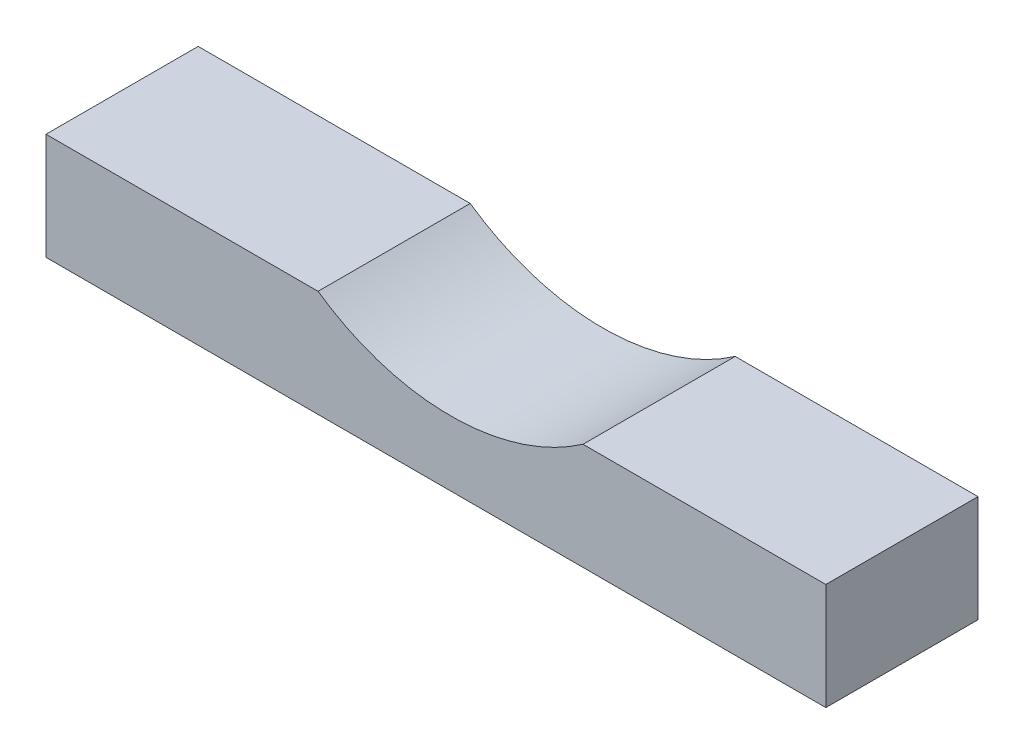
ISO-10303-21;
HEADER;
FILE_DESCRIPTION(('STEP AP214'),'2;1');
FILE_NAME('part.step','',(''),(''),'','','');
FILE_SCHEMA(('AUTOMOTIVE_DESIGN { 1 0 10303 214 1 1 1 1 }'));
ENDSEC;
DATA;
#1=APPLICATION_CONTEXT('core data for automotive mechanical design processes');
#2=APPLICATION_PROTOCOL_DEFINITION('international standard','automotive_design',2000,#1);
#3=PRODUCT_CONTEXT('',#1,'mechanical');
#4=PRODUCT('Part','Part','',(#3));
#5=PRODUCT_RELATED_PRODUCT_CATEGORY('part','',(#4));
#6=PRODUCT_DEFINITION_FORMATION('','',#4);
#7=PRODUCT_DEFINITION_CONTEXT('part definition',#1,'design');
#8=PRODUCT_DEFINITION('design','',#6,#7);
#9=PRODUCT_DEFINITION_SHAPE('','',#8);
#10=(LENGTH_UNIT() NAMED_UNIT(*) SI_UNIT(.MILLI.,.METRE.));
#11=(NAMED_UNIT(*) PLANE_ANGLE_UNIT() SI_UNIT($,.RADIAN.));
#12=(NAMED_UNIT(*) SI_UNIT($,.STERADIAN.) SOLID_ANGLE_UNIT());
#13=UNCERTAINTY_MEASURE_WITH_UNIT(LENGTH_MEASURE(1.E-05),#10,'distance_accuracy_value','');
#14=(GEOMETRIC_REPRESENTATION_CONTEXT(3) GLOBAL_UNCERTAINTY_ASSIGNED_CONTEXT((#13)) GLOBAL_UNIT_ASSIGNED_CONTEXT((#10,
#11,#12)) REPRESENTATION_CONTEXT('',''));
#15=CARTESIAN_POINT('',(0.,0.,0.));
#16=DIRECTION('',(0.,0.,1.));
#17=DIRECTION('',(1.,0.,0.));
#18=AXIS2_PLACEMENT_3D('',#15,#16,#17);
#19=CARTESIAN_POINT('',(0.,0.,0.));
#20=DIRECTION('',(0.,0.,1.));
#21=DIRECTION('',(1.,0.,0.));
#22=AXIS2_PLACEMENT_3D('',#19,#20,#21);
#23=PLANE('',#22);
#24=DIRECTION('',(0.,1.,0.));
#25=VECTOR('',#24,1.);
#26=CARTESIAN_POINT('',(-101.288011779111,-74.3328180867016,0.));
#27=LINE('',#26,#25);
#28=CARTESIAN_POINT('',(-101.288011779111,-74.3328180867016,0.));
#29=VERTEX_POINT('',#28);
#30=CARTESIAN_POINT('',(-101.288011779111,-47.6274288724276,0.));
#31=VERTEX_POINT('',#30);
#32=EDGE_CURVE('E98',#29,#31,#27,.T.);
#33=ORIENTED_EDGE('',*,*,#32,.F.);
#34=DIRECTION('',(-1.,0.,0.));
#35=VECTOR('',#34,1.);
#36=CARTESIAN_POINT('',(93.967860132655,-74.3328180867016,0.));
#37=LINE('',#36,#35);
#38=CARTESIAN_POINT('',(93.967860132655,-74.3328180867016,0.));
#39=VERTEX_POINT('',#38);
#40=EDGE_CURVE('E116',#39,#29,#37,.T.);
#41=ORIENTED_EDGE('',*,*,#40,.F.);
#42=DIRECTION('',(0.,1.,0.));
#43=VECTOR('',#42,1.);
#44=CARTESIAN_POINT('',(93.967860132655,-74.3328180867016,0.));
#45=LINE('',#44,#43);
#46=CARTESIAN_POINT('',(93.967860132655,-47.6274288724276,0.));
#47=VERTEX_POINT('',#46);
#48=EDGE_CURVE('E113',#39,#47,#45,.T.);
#49=ORIENTED_EDGE('',*,*,#48,.T.);
#50=DIRECTION('',(1.,0.,0.));
#51=VECTOR('',#50,1.);
#52=CARTESIAN_POINT('',(33.1703123139027,-47.6274288724276,0.));
#53=LINE('',#52,#51);
#54=CARTESIAN_POINT('',(33.1703123139027,-47.6274288724277,0.));
#55=VERTEX_POINT('',#54);
#56=EDGE_CURVE('E110',#55,#47,#53,.T.);
#57=ORIENTED_EDGE('',*,*,#56,.F.);
#58=CARTESIAN_POINT('',(0.,0.,0.));
#59=DIRECTION('',(0.,0.,1.));
#60=DIRECTION('',(1.,0.,0.));
#61=AXIS2_PLACEMENT_3D('',#58,#59,#60);
#62=CIRCLE('',#61,58.04);
#63=CARTESIAN_POINT('',(-33.1703123139027,-47.6274288724276,0.));
#64=VERTEX_POINT('',#63);
#65=EDGE_CURVE('E101',#64,#55,#62,.T.);
#66=ORIENTED_EDGE('',*,*,#65,.F.);
#67=DIRECTION('',(1.,0.,0.));
#68=VECTOR('',#67,1.);
#69=CARTESIAN_POINT('',(-101.288011779111,-47.6274288724276,0.));
#70=LINE('',#69,#68);
#71=EDGE_CURVE('E90',#31,#64,#70,.T.);
#72=ORIENTED_EDGE('',*,*,#71,.F.);
#73=EDGE_LOOP('',(#33,#41,#49,#57,#66,#72));
#74=FACE_BOUND('',#73,.T.);
#75=ADVANCED_FACE('F34',(#74),#23,.T.);
#76=CARTESIAN_POINT('',(93.967860132655,-74.3328180867016,-235.173674875945));
#77=DIRECTION('',(0.,1.,0.));
#78=DIRECTION('',(-1.,0.,0.));
#79=AXIS2_PLACEMENT_3D('',#76,#77,#78);
#80=PLANE('',#79);
#81=DIRECTION('',(0.,0.,1.));
#82=VECTOR('',#81,1.);
#83=CARTESIAN_POINT('',(-101.288011779111,-74.3328180867016,-235.173674875945));
#84=LINE('',#83,#82);
#85=CARTESIAN_POINT('',(-101.288011779111,-74.3328180867016,-38.1));
#86=VERTEX_POINT('',#85);
#87=EDGE_CURVE('E104',#86,#29,#84,.T.);
#88=ORIENTED_EDGE('',*,*,#87,.F.);
#89=DIRECTION('',(1.,0.,0.));
#90=VECTOR('',#89,1.);
#91=CARTESIAN_POINT('',(93.967860132655,-74.3328180867016,-38.1));
#92=LINE('',#91,#90);
#93=CARTESIAN_POINT('',(93.967860132655,-74.3328180867016,-38.1));
#94=VERTEX_POINT('',#93);
#95=EDGE_CURVE('E38',#86,#94,#92,.T.);
#96=ORIENTED_EDGE('',*,*,#95,.T.);
#97=DIRECTION('',(0.,0.,1.));
#98=VECTOR('',#97,1.);
#99=CARTESIAN_POINT('',(93.967860132655,-74.3328180867016,-235.173674875945));
#100=LINE('',#99,#98);
#101=EDGE_CURVE('E119',#94,#39,#100,.T.);
#102=ORIENTED_EDGE('',*,*,#101,.T.);
#103=ORIENTED_EDGE('',*,*,#40,.T.);
#104=EDGE_LOOP('',(#88,#96,#102,#103));
#105=FACE_BOUND('',#104,.T.);
#106=ADVANCED_FACE('F137',(#105),#80,.F.);
#107=CARTESIAN_POINT('',(93.967860132655,-74.3328180867016,-235.173674875945));
#108=DIRECTION('',(1.,0.,0.));
#109=DIRECTION('',(0.,0.,-1.));
#110=AXIS2_PLACEMENT_3D('',#107,#108,#109);
#111=PLANE('',#110);
#112=DIRECTION('',(0.,-1.,0.));
#113=VECTOR('',#112,1.);
#114=CARTESIAN_POINT('',(93.967860132655,-74.3328180867016,-38.1));
#115=LINE('',#114,#113);
#116=CARTESIAN_POINT('',(93.967860132655,-47.6274288724276,-38.1));
#117=VERTEX_POINT('',#116);
#118=EDGE_CURVE('E130',#117,#94,#115,.T.);
#119=ORIENTED_EDGE('',*,*,#118,.F.);
#120=DIRECTION('',(0.,0.,1.));
#121=VECTOR('',#120,1.);
#122=CARTESIAN_POINT('',(93.967860132655,-47.6274288724276,-235.173674875945));
#123=LINE('',#122,#121);
#124=EDGE_CURVE('E121',#117,#47,#123,.T.);
#125=ORIENTED_EDGE('',*,*,#124,.T.);
#126=ORIENTED_EDGE('',*,*,#48,.F.);
#127=ORIENTED_EDGE('',*,*,#101,.F.);
#128=EDGE_LOOP('',(#119,#125,#126,#127));
#129=FACE_BOUND('',#128,.T.);
#130=ADVANCED_FACE('F149',(#129),#111,.T.);
#131=CARTESIAN_POINT('',(33.1703123139027,-47.6274288724276,-235.173674875945));
#132=DIRECTION('',(0.,-1.,0.));
#133=DIRECTION('',(0.,0.,-1.));
#134=AXIS2_PLACEMENT_3D('',#131,#132,#133);
#135=PLANE('',#134);
#136=ORIENTED_EDGE('',*,*,#124,.F.);
#137=DIRECTION('',(-1.,0.,0.));
#138=VECTOR('',#137,1.);
#139=CARTESIAN_POINT('',(33.1703123139027,-47.6274288724276,-38.1));
#140=LINE('',#139,#138);
#141=CARTESIAN_POINT('',(33.1703123139027,-47.6274288724276,-38.1));
#142=VERTEX_POINT('',#141);
#143=EDGE_CURVE('E128',#117,#142,#140,.T.);
#144=ORIENTED_EDGE('',*,*,#143,.T.);
#145=DIRECTION('',(0.,0.,1.));
#146=VECTOR('',#145,1.);
#147=CARTESIAN_POINT('',(33.1703123139027,-47.6274288724277,-235.173674875945));
#148=LINE('',#147,#146);
#149=EDGE_CURVE('E123',#142,#55,#148,.T.);
#150=ORIENTED_EDGE('',*,*,#149,.T.);
#151=ORIENTED_EDGE('',*,*,#56,.T.);
#152=EDGE_LOOP('',(#136,#144,#150,#151));
#153=FACE_BOUND('',#152,.T.);
#154=ADVANCED_FACE('F154',(#153),#135,.F.);
#155=CARTESIAN_POINT('',(0.,0.,-235.173674875945));
#156=DIRECTION('',(0.,0.,1.));
#157=DIRECTION('',(1.,0.,0.));
#158=AXIS2_PLACEMENT_3D('',#155,#156,#157);
#159=CYLINDRICAL_SURFACE('',#158,58.04);
#160=ORIENTED_EDGE('',*,*,#149,.F.);
#161=CARTESIAN_POINT('',(0.,0.,-38.1));
#162=DIRECTION('',(0.,0.,1.));
#163=DIRECTION('',(1.,0.,0.));
#164=AXIS2_PLACEMENT_3D('',#161,#162,#163);
#165=CIRCLE('',#164,58.04);
#166=CARTESIAN_POINT('',(-33.1703123139027,-47.6274288724276,-38.1));
#167=VERTEX_POINT('',#166);
#168=EDGE_CURVE('E55',#142,#167,#165,.F.);
#169=ORIENTED_EDGE('',*,*,#168,.T.);
#170=DIRECTION('',(0.,0.,1.));
#171=VECTOR('',#170,1.);
#172=CARTESIAN_POINT('',(-33.1703123139027,-47.6274288724276,-235.173674875945));
#173=LINE('',#172,#171);
#174=EDGE_CURVE('E94',#167,#64,#173,.T.);
#175=ORIENTED_EDGE('',*,*,#174,.T.);
#176=ORIENTED_EDGE('',*,*,#65,.T.);
#177=EDGE_LOOP('',(#160,#169,#175,#176));
#178=FACE_BOUND('',#177,.T.);
#179=ADVANCED_FACE('F126',(#178),#159,.F.);
#180=CARTESIAN_POINT('',(-101.288011779111,-47.6274288724276,-235.173674875945));
#181=DIRECTION('',(0.,-1.,0.));
#182=DIRECTION('',(0.,0.,-1.));
#183=AXIS2_PLACEMENT_3D('',#180,#181,#182);
#184=PLANE('',#183);
#185=ORIENTED_EDGE('',*,*,#174,.F.);
#186=DIRECTION('',(-1.,0.,0.));
#187=VECTOR('',#186,1.);
#188=CARTESIAN_POINT('',(-101.288011779111,-47.6274288724276,-38.1));
#189=LINE('',#188,#187);
#190=CARTESIAN_POINT('',(-101.288011779111,-47.6274288724276,-38.1));
#191=VERTEX_POINT('',#190);
#192=EDGE_CURVE('E43',#167,#191,#189,.T.);
#193=ORIENTED_EDGE('',*,*,#192,.T.);
#194=DIRECTION('',(0.,0.,1.));
#195=VECTOR('',#194,1.);
#196=CARTESIAN_POINT('',(-101.288011779111,-47.6274288724276,-235.173674875945));
#197=LINE('',#196,#195);
#198=EDGE_CURVE('E87',#191,#31,#197,.T.);
#199=ORIENTED_EDGE('',*,*,#198,.T.);
#200=ORIENTED_EDGE('',*,*,#71,.T.);
#201=EDGE_LOOP('',(#185,#193,#199,#200));
#202=FACE_BOUND('',#201,.T.);
#203=ADVANCED_FACE('F89',(#202),#184,.F.);
#204=CARTESIAN_POINT('',(-101.288011779111,-74.3328180867016,-235.173674875945));
#205=DIRECTION('',(1.,0.,0.));
#206=DIRECTION('',(0.,0.,-1.));
#207=AXIS2_PLACEMENT_3D('',#204,#205,#206);
#208=PLANE('',#207);
#209=ORIENTED_EDGE('',*,*,#198,.F.);
#210=DIRECTION('',(0.,-1.,0.));
#211=VECTOR('',#210,1.);
#212=CARTESIAN_POINT('',(-101.288011779111,-74.3328180867016,-38.1));
#213=LINE('',#212,#211);
#214=EDGE_CURVE('E11',#191,#86,#213,.T.);
#215=ORIENTED_EDGE('',*,*,#214,.T.);
#216=ORIENTED_EDGE('',*,*,#87,.T.);
#217=ORIENTED_EDGE('',*,*,#32,.T.);
#218=EDGE_LOOP('',(#209,#215,#216,#217));
#219=FACE_BOUND('',#218,.T.);
#220=ADVANCED_FACE('F36',(#219),#208,.F.);
#221=CARTESIAN_POINT('',(0.,0.,-38.1));
#222=DIRECTION('',(0.,0.,1.));
#223=DIRECTION('',(1.,0.,0.));
#224=AXIS2_PLACEMENT_3D('',#221,#222,#223);
#225=PLANE('',#224);
#226=ORIENTED_EDGE('',*,*,#192,.F.);
#227=ORIENTED_EDGE('',*,*,#168,.F.);
#228=ORIENTED_EDGE('',*,*,#143,.F.);
#229=ORIENTED_EDGE('',*,*,#118,.T.);
#230=ORIENTED_EDGE('',*,*,#95,.F.);
#231=ORIENTED_EDGE('',*,*,#214,.F.);
#232=EDGE_LOOP('',(#226,#227,#228,#229,#230,#231));
#233=FACE_BOUND('',#232,.T.);
#234=ADVANCED_FACE('F138',(#233),#225,.F.);
#235=CLOSED_SHELL('',(#75,#106,#130,#154,#179,#203,#220,#234));
#236=MANIFOLD_SOLID_BREP('B2',#235);
#237=ADVANCED_BREP_SHAPE_REPRESENTATION('',(#18,#236),#14);
#238=SHAPE_DEFINITION_REPRESENTATION(#9,#237);
ENDSEC;
END-ISO-10303-21;
